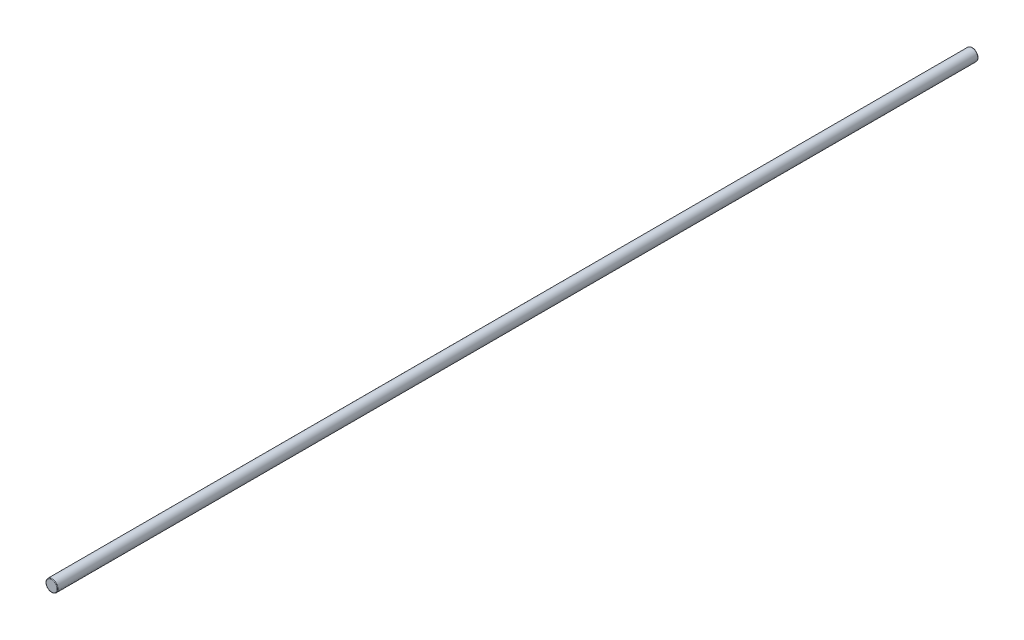
ISO-10303-21;
HEADER;
FILE_DESCRIPTION(('STEP AP214'),'2;1');
FILE_NAME('part.step','',(''),(''),'','','');
FILE_SCHEMA(('AUTOMOTIVE_DESIGN { 1 0 10303 214 1 1 1 1 }'));
ENDSEC;
DATA;
#1=APPLICATION_CONTEXT('core data for automotive mechanical design processes');
#2=APPLICATION_PROTOCOL_DEFINITION('international standard','automotive_design',2000,#1);
#3=PRODUCT_CONTEXT('',#1,'mechanical');
#4=PRODUCT('Part','Part','',(#3));
#5=PRODUCT_RELATED_PRODUCT_CATEGORY('part','',(#4));
#6=PRODUCT_DEFINITION_FORMATION('','',#4);
#7=PRODUCT_DEFINITION_CONTEXT('part definition',#1,'design');
#8=PRODUCT_DEFINITION('design','',#6,#7);
#9=PRODUCT_DEFINITION_SHAPE('','',#8);
#10=(LENGTH_UNIT() NAMED_UNIT(*) SI_UNIT(.MILLI.,.METRE.));
#11=(NAMED_UNIT(*) PLANE_ANGLE_UNIT() SI_UNIT($,.RADIAN.));
#12=(NAMED_UNIT(*) SI_UNIT($,.STERADIAN.) SOLID_ANGLE_UNIT());
#13=UNCERTAINTY_MEASURE_WITH_UNIT(LENGTH_MEASURE(1.E-05),#10,'distance_accuracy_value','');
#14=(GEOMETRIC_REPRESENTATION_CONTEXT(3) GLOBAL_UNCERTAINTY_ASSIGNED_CONTEXT((#13)) GLOBAL_UNIT_ASSIGNED_CONTEXT((#10,
#11,#12)) REPRESENTATION_CONTEXT('',''));
#15=CARTESIAN_POINT('',(0.,0.,0.));
#16=DIRECTION('',(0.,0.,1.));
#17=DIRECTION('',(1.,0.,0.));
#18=AXIS2_PLACEMENT_3D('',#15,#16,#17);
#19=CARTESIAN_POINT('',(0.,0.,349.));
#20=DIRECTION('',(0.,0.,-1.));
#21=DIRECTION('',(-1.,0.,0.));
#22=AXIS2_PLACEMENT_3D('',#19,#20,#21);
#23=CYLINDRICAL_SURFACE('',#22,2.25);
#24=CARTESIAN_POINT('',(0.,0.,0.199999999999978));
#25=DIRECTION('',(0.,0.,1.));
#26=DIRECTION('',(1.,0.,0.));
#27=AXIS2_PLACEMENT_3D('',#24,#25,#26);
#28=CIRCLE('',#27,2.25);
#29=CARTESIAN_POINT('',(2.25,0.,0.199999999999978));
#30=VERTEX_POINT('',#29);
#31=EDGE_CURVE('E43',#30,#30,#28,.T.);
#32=ORIENTED_EDGE('',*,*,#31,.T.);
#33=EDGE_LOOP('',(#32));
#34=FACE_BOUND('',#33,.T.);
#35=CARTESIAN_POINT('',(0.,0.,348.8));
#36=DIRECTION('',(0.,0.,1.));
#37=DIRECTION('',(1.,0.,0.));
#38=AXIS2_PLACEMENT_3D('',#35,#36,#37);
#39=CIRCLE('',#38,2.25);
#40=CARTESIAN_POINT('',(2.25,0.,348.8));
#41=VERTEX_POINT('',#40);
#42=EDGE_CURVE('E47',#41,#41,#39,.F.);
#43=ORIENTED_EDGE('',*,*,#42,.T.);
#44=EDGE_LOOP('',(#43));
#45=FACE_BOUND('',#44,.T.);
#46=ADVANCED_FACE('F33',(#34,#45),#23,.T.);
#47=CARTESIAN_POINT('',(0.,0.,349.));
#48=DIRECTION('',(0.,0.,1.));
#49=DIRECTION('',(1.,0.,0.));
#50=AXIS2_PLACEMENT_3D('',#47,#48,#49);
#51=PLANE('',#50);
#52=CARTESIAN_POINT('',(0.,0.,349.));
#53=DIRECTION('',(0.,0.,1.));
#54=DIRECTION('',(1.,0.,0.));
#55=AXIS2_PLACEMENT_3D('',#52,#53,#54);
#56=CIRCLE('',#55,2.05);
#57=CARTESIAN_POINT('',(2.05,0.,349.));
#58=VERTEX_POINT('',#57);
#59=EDGE_CURVE('E10',#58,#58,#56,.T.);
#60=ORIENTED_EDGE('',*,*,#59,.T.);
#61=EDGE_LOOP('',(#60));
#62=FACE_BOUND('',#61,.T.);
#63=ADVANCED_FACE('F66',(#62),#51,.T.);
#64=CARTESIAN_POINT('',(0.,0.,0.));
#65=DIRECTION('',(0.,0.,1.));
#66=DIRECTION('',(1.,0.,0.));
#67=AXIS2_PLACEMENT_3D('',#64,#65,#66);
#68=PLANE('',#67);
#69=CARTESIAN_POINT('',(0.,0.,0.));
#70=DIRECTION('',(0.,0.,1.));
#71=DIRECTION('',(1.,0.,0.));
#72=AXIS2_PLACEMENT_3D('',#69,#70,#71);
#73=CIRCLE('',#72,2.05);
#74=CARTESIAN_POINT('',(2.05,0.,0.));
#75=VERTEX_POINT('',#74);
#76=EDGE_CURVE('E39',#75,#75,#73,.F.);
#77=ORIENTED_EDGE('',*,*,#76,.T.);
#78=EDGE_LOOP('',(#77));
#79=FACE_BOUND('',#78,.T.);
#80=ADVANCED_FACE('F62',(#79),#68,.F.);
#81=CARTESIAN_POINT('',(0.,0.,0.199999999999978));
#82=DIRECTION('',(0.,0.,1.));
#83=DIRECTION('',(1.,0.,0.));
#84=AXIS2_PLACEMENT_3D('',#81,#82,#83);
#85=TOROIDAL_SURFACE('',#84,2.05,0.2);
#86=ORIENTED_EDGE('',*,*,#76,.F.);
#87=EDGE_LOOP('',(#86));
#88=FACE_BOUND('',#87,.T.);
#89=ORIENTED_EDGE('',*,*,#31,.F.);
#90=EDGE_LOOP('',(#89));
#91=FACE_BOUND('',#90,.T.);
#92=ADVANCED_FACE('F57',(#88,#91),#85,.T.);
#93=CARTESIAN_POINT('',(0.,0.,348.8));
#94=DIRECTION('',(0.,0.,1.));
#95=DIRECTION('',(1.,0.,0.));
#96=AXIS2_PLACEMENT_3D('',#93,#94,#95);
#97=TOROIDAL_SURFACE('',#96,2.05,0.2);
#98=ORIENTED_EDGE('',*,*,#42,.F.);
#99=EDGE_LOOP('',(#98));
#100=FACE_BOUND('',#99,.T.);
#101=ORIENTED_EDGE('',*,*,#59,.F.);
#102=EDGE_LOOP('',(#101));
#103=FACE_BOUND('',#102,.T.);
#104=ADVANCED_FACE('F54',(#100,#103),#97,.T.);
#105=CLOSED_SHELL('',(#46,#63,#80,#92,#104));
#106=MANIFOLD_SOLID_BREP('B2',#105);
#107=ADVANCED_BREP_SHAPE_REPRESENTATION('',(#18,#106),#14);
#108=SHAPE_DEFINITION_REPRESENTATION(#9,#107);
ENDSEC;
END-ISO-10303-21;
